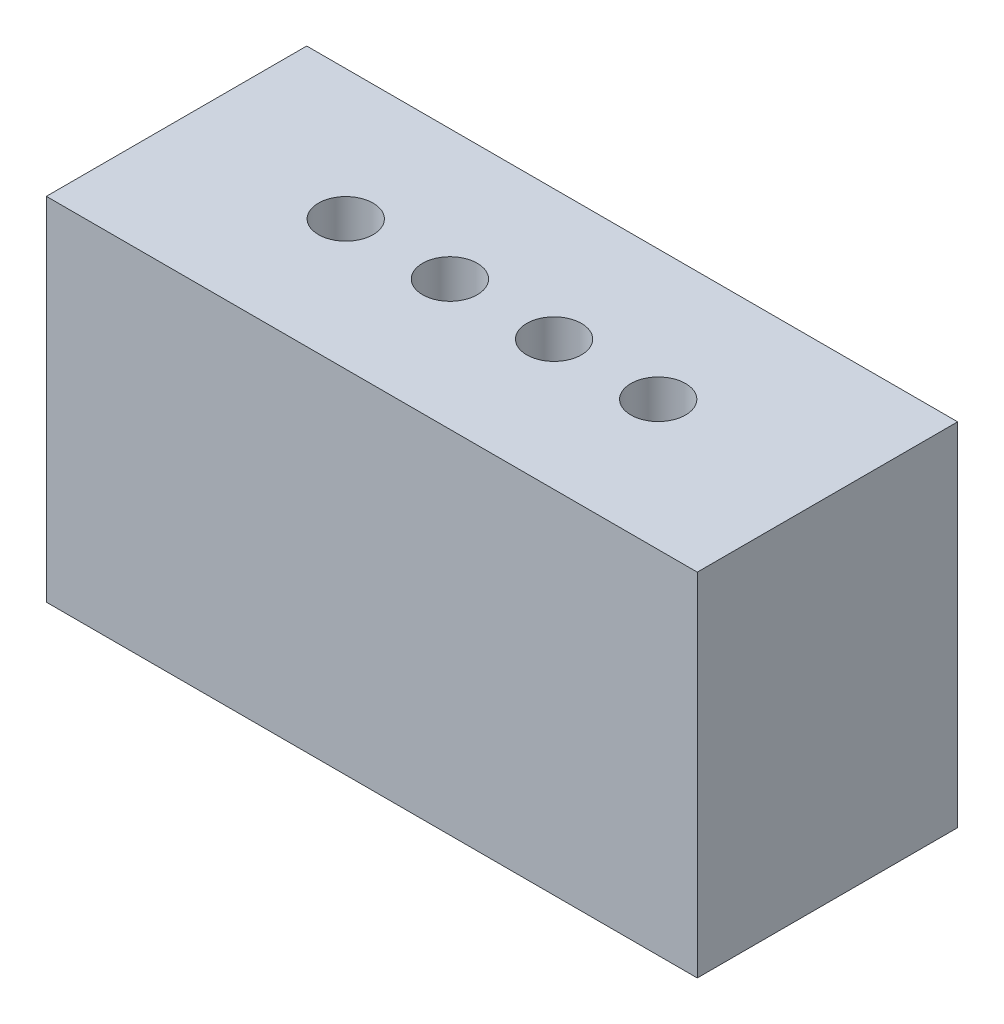
ISO-10303-21;
HEADER;
FILE_DESCRIPTION(('STEP AP214'),'2;1');
FILE_NAME('part.step','',(''),(''),'','','');
FILE_SCHEMA(('AUTOMOTIVE_DESIGN { 1 0 10303 214 1 1 1 1 }'));
ENDSEC;
DATA;
#1=APPLICATION_CONTEXT('core data for automotive mechanical design processes');
#2=APPLICATION_PROTOCOL_DEFINITION('international standard','automotive_design',2000,#1);
#3=PRODUCT_CONTEXT('',#1,'mechanical');
#4=PRODUCT('Part','Part','',(#3));
#5=PRODUCT_RELATED_PRODUCT_CATEGORY('part','',(#4));
#6=PRODUCT_DEFINITION_FORMATION('','',#4);
#7=PRODUCT_DEFINITION_CONTEXT('part definition',#1,'design');
#8=PRODUCT_DEFINITION('design','',#6,#7);
#9=PRODUCT_DEFINITION_SHAPE('','',#8);
#10=(LENGTH_UNIT() NAMED_UNIT(*) SI_UNIT(.MILLI.,.METRE.));
#11=(NAMED_UNIT(*) PLANE_ANGLE_UNIT() SI_UNIT($,.RADIAN.));
#12=(NAMED_UNIT(*) SI_UNIT($,.STERADIAN.) SOLID_ANGLE_UNIT());
#13=UNCERTAINTY_MEASURE_WITH_UNIT(LENGTH_MEASURE(1.E-05),#10,'distance_accuracy_value','');
#14=(GEOMETRIC_REPRESENTATION_CONTEXT(3) GLOBAL_UNCERTAINTY_ASSIGNED_CONTEXT((#13)) GLOBAL_UNIT_ASSIGNED_CONTEXT((#10,
#11,#12)) REPRESENTATION_CONTEXT('',''));
#15=CARTESIAN_POINT('',(0.,0.,0.));
#16=DIRECTION('',(0.,0.,1.));
#17=DIRECTION('',(1.,0.,0.));
#18=AXIS2_PLACEMENT_3D('',#15,#16,#17);
#19=CARTESIAN_POINT('',(0.,27.,0.));
#20=DIRECTION('',(1.,0.,0.));
#21=DIRECTION('',(0.,0.,-1.));
#22=AXIS2_PLACEMENT_3D('',#19,#20,#21);
#23=PLANE('',#22);
#24=DIRECTION('',(0.,0.,1.));
#25=VECTOR('',#24,1.);
#26=CARTESIAN_POINT('',(0.,0.,0.));
#27=LINE('',#26,#25);
#28=CARTESIAN_POINT('',(0.,0.,-20.));
#29=VERTEX_POINT('',#28);
#30=CARTESIAN_POINT('',(0.,0.,0.));
#31=VERTEX_POINT('',#30);
#32=EDGE_CURVE('E98',#29,#31,#27,.T.);
#33=ORIENTED_EDGE('',*,*,#32,.T.);
#34=DIRECTION('',(0.,-1.,0.));
#35=VECTOR('',#34,1.);
#36=CARTESIAN_POINT('',(0.,27.,0.));
#37=LINE('',#36,#35);
#38=CARTESIAN_POINT('',(0.,27.,0.));
#39=VERTEX_POINT('',#38);
#40=EDGE_CURVE('E11',#39,#31,#37,.T.);
#41=ORIENTED_EDGE('',*,*,#40,.F.);
#42=DIRECTION('',(0.,0.,1.));
#43=VECTOR('',#42,1.);
#44=CARTESIAN_POINT('',(0.,27.,0.));
#45=LINE('',#44,#43);
#46=CARTESIAN_POINT('',(0.,27.,-20.));
#47=VERTEX_POINT('',#46);
#48=EDGE_CURVE('E86',#47,#39,#45,.T.);
#49=ORIENTED_EDGE('',*,*,#48,.F.);
#50=DIRECTION('',(0.,-1.,0.));
#51=VECTOR('',#50,1.);
#52=CARTESIAN_POINT('',(0.,27.,-20.));
#53=LINE('',#52,#51);
#54=EDGE_CURVE('E94',#47,#29,#53,.T.);
#55=ORIENTED_EDGE('',*,*,#54,.T.);
#56=EDGE_LOOP('',(#33,#41,#49,#55));
#57=FACE_BOUND('',#56,.T.);
#58=ADVANCED_FACE('F35',(#57),#23,.F.);
#59=CARTESIAN_POINT('',(0.,27.,0.));
#60=DIRECTION('',(0.,0.,-1.));
#61=DIRECTION('',(-1.,0.,0.));
#62=AXIS2_PLACEMENT_3D('',#59,#60,#61);
#63=PLANE('',#62);
#64=DIRECTION('',(1.,0.,0.));
#65=VECTOR('',#64,1.);
#66=CARTESIAN_POINT('',(0.,0.,0.));
#67=LINE('',#66,#65);
#68=CARTESIAN_POINT('',(50.,0.,0.));
#69=VERTEX_POINT('',#68);
#70=EDGE_CURVE('E90',#31,#69,#67,.T.);
#71=ORIENTED_EDGE('',*,*,#70,.T.);
#72=DIRECTION('',(0.,-1.,0.));
#73=VECTOR('',#72,1.);
#74=CARTESIAN_POINT('',(50.,27.,0.));
#75=LINE('',#74,#73);
#76=CARTESIAN_POINT('',(50.,27.,0.));
#77=VERTEX_POINT('',#76);
#78=EDGE_CURVE('E43',#77,#69,#75,.T.);
#79=ORIENTED_EDGE('',*,*,#78,.F.);
#80=DIRECTION('',(1.,0.,0.));
#81=VECTOR('',#80,1.);
#82=CARTESIAN_POINT('',(0.,27.,0.));
#83=LINE('',#82,#81);
#84=EDGE_CURVE('E81',#39,#77,#83,.T.);
#85=ORIENTED_EDGE('',*,*,#84,.F.);
#86=ORIENTED_EDGE('',*,*,#40,.T.);
#87=EDGE_LOOP('',(#71,#79,#85,#86));
#88=FACE_BOUND('',#87,.T.);
#89=ADVANCED_FACE('F89',(#88),#63,.F.);
#90=CARTESIAN_POINT('',(50.,27.,0.));
#91=DIRECTION('',(-1.,0.,0.));
#92=DIRECTION('',(0.,0.,1.));
#93=AXIS2_PLACEMENT_3D('',#90,#91,#92);
#94=PLANE('',#93);
#95=DIRECTION('',(0.,0.,-1.));
#96=VECTOR('',#95,1.);
#97=CARTESIAN_POINT('',(50.,0.,0.));
#98=LINE('',#97,#96);
#99=CARTESIAN_POINT('',(50.,0.,-20.));
#100=VERTEX_POINT('',#99);
#101=EDGE_CURVE('E68',#69,#100,#98,.T.);
#102=ORIENTED_EDGE('',*,*,#101,.T.);
#103=DIRECTION('',(0.,-1.,0.));
#104=VECTOR('',#103,1.);
#105=CARTESIAN_POINT('',(50.,27.,-20.));
#106=LINE('',#105,#104);
#107=CARTESIAN_POINT('',(50.,27.,-20.));
#108=VERTEX_POINT('',#107);
#109=EDGE_CURVE('E91',#108,#100,#106,.T.);
#110=ORIENTED_EDGE('',*,*,#109,.F.);
#111=DIRECTION('',(0.,0.,-1.));
#112=VECTOR('',#111,1.);
#113=CARTESIAN_POINT('',(50.,27.,0.));
#114=LINE('',#113,#112);
#115=EDGE_CURVE('E84',#77,#108,#114,.T.);
#116=ORIENTED_EDGE('',*,*,#115,.F.);
#117=ORIENTED_EDGE('',*,*,#78,.T.);
#118=EDGE_LOOP('',(#102,#110,#116,#117));
#119=FACE_BOUND('',#118,.T.);
#120=ADVANCED_FACE('F92',(#119),#94,.F.);
#121=CARTESIAN_POINT('',(0.,27.,-20.));
#122=DIRECTION('',(0.,0.,1.));
#123=DIRECTION('',(1.,0.,0.));
#124=AXIS2_PLACEMENT_3D('',#121,#122,#123);
#125=PLANE('',#124);
#126=DIRECTION('',(-1.,0.,0.));
#127=VECTOR('',#126,1.);
#128=CARTESIAN_POINT('',(0.,0.,-20.));
#129=LINE('',#128,#127);
#130=EDGE_CURVE('E74',#100,#29,#129,.T.);
#131=ORIENTED_EDGE('',*,*,#130,.T.);
#132=ORIENTED_EDGE('',*,*,#54,.F.);
#133=DIRECTION('',(-1.,0.,0.));
#134=VECTOR('',#133,1.);
#135=CARTESIAN_POINT('',(0.,27.,-20.));
#136=LINE('',#135,#134);
#137=EDGE_CURVE('E51',#108,#47,#136,.T.);
#138=ORIENTED_EDGE('',*,*,#137,.F.);
#139=ORIENTED_EDGE('',*,*,#109,.T.);
#140=EDGE_LOOP('',(#131,#132,#138,#139));
#141=FACE_BOUND('',#140,.T.);
#142=ADVANCED_FACE('F106',(#141),#125,.F.);
#143=CARTESIAN_POINT('',(0.,27.,0.));
#144=DIRECTION('',(0.,-1.,0.));
#145=DIRECTION('',(0.,0.,-1.));
#146=AXIS2_PLACEMENT_3D('',#143,#144,#145);
#147=PLANE('',#146);
#148=CARTESIAN_POINT('',(13.,27.,-10.));
#149=DIRECTION('',(0.,1.,0.));
#150=DIRECTION('',(0.,0.,1.));
#151=AXIS2_PLACEMENT_3D('',#148,#149,#150);
#152=CIRCLE('',#151,2.09999999999999);
#153=CARTESIAN_POINT('',(13.,27.,-7.90000000000001));
#154=VERTEX_POINT('',#153);
#155=EDGE_CURVE('E132',#154,#154,#152,.T.);
#156=ORIENTED_EDGE('',*,*,#155,.F.);
#157=EDGE_LOOP('',(#156));
#158=FACE_BOUND('',#157,.T.);
#159=CARTESIAN_POINT('',(21.,27.,-10.));
#160=DIRECTION('',(0.,1.,0.));
#161=DIRECTION('',(0.,0.,1.));
#162=AXIS2_PLACEMENT_3D('',#159,#160,#161);
#163=CIRCLE('',#162,2.09999999999999);
#164=CARTESIAN_POINT('',(21.,27.,-7.90000000000001));
#165=VERTEX_POINT('',#164);
#166=EDGE_CURVE('E126',#165,#165,#163,.T.);
#167=ORIENTED_EDGE('',*,*,#166,.F.);
#168=EDGE_LOOP('',(#167));
#169=FACE_BOUND('',#168,.T.);
#170=CARTESIAN_POINT('',(29.,27.,-10.));
#171=DIRECTION('',(0.,1.,0.));
#172=DIRECTION('',(0.,0.,1.));
#173=AXIS2_PLACEMENT_3D('',#170,#171,#172);
#174=CIRCLE('',#173,2.09999999999999);
#175=CARTESIAN_POINT('',(29.,27.,-7.90000000000001));
#176=VERTEX_POINT('',#175);
#177=EDGE_CURVE('E120',#176,#176,#174,.T.);
#178=ORIENTED_EDGE('',*,*,#177,.F.);
#179=EDGE_LOOP('',(#178));
#180=FACE_BOUND('',#179,.T.);
#181=CARTESIAN_POINT('',(37.,27.,-10.));
#182=DIRECTION('',(0.,1.,0.));
#183=DIRECTION('',(0.,0.,1.));
#184=AXIS2_PLACEMENT_3D('',#181,#182,#183);
#185=CIRCLE('',#184,2.09999999999999);
#186=CARTESIAN_POINT('',(37.,27.,-7.90000000000001));
#187=VERTEX_POINT('',#186);
#188=EDGE_CURVE('E114',#187,#187,#185,.T.);
#189=ORIENTED_EDGE('',*,*,#188,.F.);
#190=EDGE_LOOP('',(#189));
#191=FACE_BOUND('',#190,.T.);
#192=ORIENTED_EDGE('',*,*,#48,.T.);
#193=ORIENTED_EDGE('',*,*,#84,.T.);
#194=ORIENTED_EDGE('',*,*,#115,.T.);
#195=ORIENTED_EDGE('',*,*,#137,.T.);
#196=EDGE_LOOP('',(#192,#193,#194,#195));
#197=FACE_BOUND('',#196,.T.);
#198=ADVANCED_FACE('F82',(#158,#169,#180,#191,#197),#147,.F.);
#199=CARTESIAN_POINT('',(0.,0.,0.));
#200=DIRECTION('',(0.,-1.,0.));
#201=DIRECTION('',(0.,0.,-1.));
#202=AXIS2_PLACEMENT_3D('',#199,#200,#201);
#203=PLANE('',#202);
#204=CARTESIAN_POINT('',(13.,0.,-10.));
#205=DIRECTION('',(0.,-1.,0.));
#206=DIRECTION('',(0.,0.,-1.));
#207=AXIS2_PLACEMENT_3D('',#204,#205,#206);
#208=CIRCLE('',#207,2.09999999999999);
#209=CARTESIAN_POINT('',(13.,0.,-12.1));
#210=VERTEX_POINT('',#209);
#211=EDGE_CURVE('E129',#210,#210,#208,.T.);
#212=ORIENTED_EDGE('',*,*,#211,.F.);
#213=EDGE_LOOP('',(#212));
#214=FACE_BOUND('',#213,.T.);
#215=CARTESIAN_POINT('',(21.,0.,-10.));
#216=DIRECTION('',(0.,-1.,0.));
#217=DIRECTION('',(0.,0.,-1.));
#218=AXIS2_PLACEMENT_3D('',#215,#216,#217);
#219=CIRCLE('',#218,2.09999999999999);
#220=CARTESIAN_POINT('',(21.,0.,-12.1));
#221=VERTEX_POINT('',#220);
#222=EDGE_CURVE('E123',#221,#221,#219,.T.);
#223=ORIENTED_EDGE('',*,*,#222,.F.);
#224=EDGE_LOOP('',(#223));
#225=FACE_BOUND('',#224,.T.);
#226=CARTESIAN_POINT('',(29.,0.,-10.));
#227=DIRECTION('',(0.,-1.,0.));
#228=DIRECTION('',(0.,0.,-1.));
#229=AXIS2_PLACEMENT_3D('',#226,#227,#228);
#230=CIRCLE('',#229,2.09999999999999);
#231=CARTESIAN_POINT('',(29.,0.,-12.1));
#232=VERTEX_POINT('',#231);
#233=EDGE_CURVE('E117',#232,#232,#230,.T.);
#234=ORIENTED_EDGE('',*,*,#233,.F.);
#235=EDGE_LOOP('',(#234));
#236=FACE_BOUND('',#235,.T.);
#237=CARTESIAN_POINT('',(37.,0.,-10.));
#238=DIRECTION('',(0.,-1.,0.));
#239=DIRECTION('',(0.,0.,-1.));
#240=AXIS2_PLACEMENT_3D('',#237,#238,#239);
#241=CIRCLE('',#240,2.09999999999999);
#242=CARTESIAN_POINT('',(37.,0.,-12.1));
#243=VERTEX_POINT('',#242);
#244=EDGE_CURVE('E101',#243,#243,#241,.T.);
#245=ORIENTED_EDGE('',*,*,#244,.F.);
#246=EDGE_LOOP('',(#245));
#247=FACE_BOUND('',#246,.T.);
#248=ORIENTED_EDGE('',*,*,#32,.F.);
#249=ORIENTED_EDGE('',*,*,#130,.F.);
#250=ORIENTED_EDGE('',*,*,#101,.F.);
#251=ORIENTED_EDGE('',*,*,#70,.F.);
#252=EDGE_LOOP('',(#248,#249,#250,#251));
#253=FACE_BOUND('',#252,.T.);
#254=ADVANCED_FACE('F109',(#214,#225,#236,#247,#253),#203,.T.);
#255=CARTESIAN_POINT('',(37.,27.,-10.));
#256=DIRECTION('',(0.,1.,0.));
#257=DIRECTION('',(0.,0.,1.));
#258=AXIS2_PLACEMENT_3D('',#255,#256,#257);
#259=CYLINDRICAL_SURFACE('',#258,2.09999999999999);
#260=ORIENTED_EDGE('',*,*,#188,.T.);
#261=EDGE_LOOP('',(#260));
#262=FACE_BOUND('',#261,.T.);
#263=ORIENTED_EDGE('',*,*,#244,.T.);
#264=EDGE_LOOP('',(#263));
#265=FACE_BOUND('',#264,.T.);
#266=ADVANCED_FACE('F148',(#262,#265),#259,.F.);
#267=CARTESIAN_POINT('',(29.,27.,-10.));
#268=DIRECTION('',(0.,1.,0.));
#269=DIRECTION('',(0.,0.,1.));
#270=AXIS2_PLACEMENT_3D('',#267,#268,#269);
#271=CYLINDRICAL_SURFACE('',#270,2.09999999999999);
#272=ORIENTED_EDGE('',*,*,#177,.T.);
#273=EDGE_LOOP('',(#272));
#274=FACE_BOUND('',#273,.T.);
#275=ORIENTED_EDGE('',*,*,#233,.T.);
#276=EDGE_LOOP('',(#275));
#277=FACE_BOUND('',#276,.T.);
#278=ADVANCED_FACE('F151',(#274,#277),#271,.F.);
#279=CARTESIAN_POINT('',(21.,27.,-10.));
#280=DIRECTION('',(0.,1.,0.));
#281=DIRECTION('',(0.,0.,1.));
#282=AXIS2_PLACEMENT_3D('',#279,#280,#281);
#283=CYLINDRICAL_SURFACE('',#282,2.09999999999999);
#284=ORIENTED_EDGE('',*,*,#166,.T.);
#285=EDGE_LOOP('',(#284));
#286=FACE_BOUND('',#285,.T.);
#287=ORIENTED_EDGE('',*,*,#222,.T.);
#288=EDGE_LOOP('',(#287));
#289=FACE_BOUND('',#288,.T.);
#290=ADVANCED_FACE('F199',(#286,#289),#283,.F.);
#291=CARTESIAN_POINT('',(13.,27.,-10.));
#292=DIRECTION('',(0.,1.,0.));
#293=DIRECTION('',(0.,0.,1.));
#294=AXIS2_PLACEMENT_3D('',#291,#292,#293);
#295=CYLINDRICAL_SURFACE('',#294,2.09999999999999);
#296=ORIENTED_EDGE('',*,*,#155,.T.);
#297=EDGE_LOOP('',(#296));
#298=FACE_BOUND('',#297,.T.);
#299=ORIENTED_EDGE('',*,*,#211,.T.);
#300=EDGE_LOOP('',(#299));
#301=FACE_BOUND('',#300,.T.);
#302=ADVANCED_FACE('F136',(#298,#301),#295,.F.);
#303=CLOSED_SHELL('',(#58,#89,#120,#142,#198,#254,#266,#278,#290,#302));
#304=MANIFOLD_SOLID_BREP('B2',#303);
#305=ADVANCED_BREP_SHAPE_REPRESENTATION('',(#18,#304),#14);
#306=SHAPE_DEFINITION_REPRESENTATION(#9,#305);
ENDSEC;
END-ISO-10303-21;
